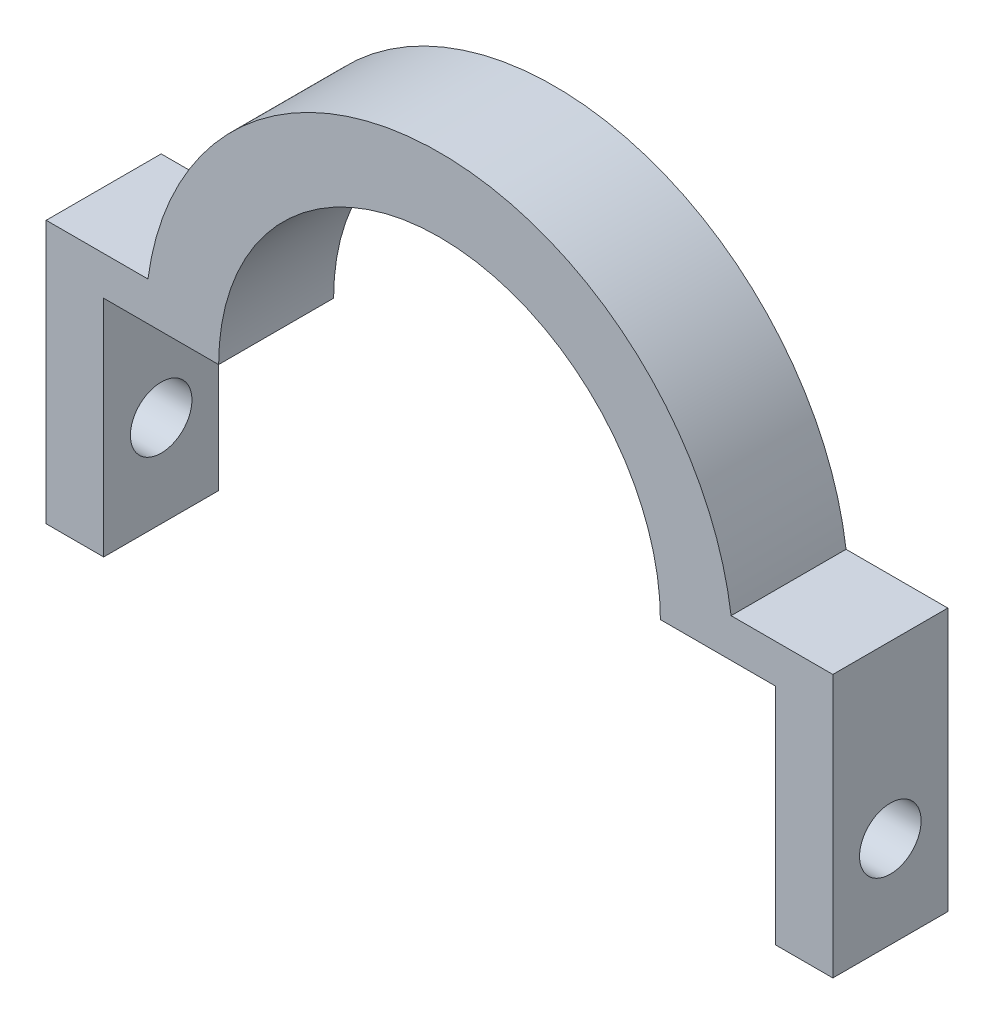
ISO-10303-21;
HEADER;
FILE_DESCRIPTION(('STEP AP214'),'2;1');
FILE_NAME('part.step','',(''),(''),'','','');
FILE_SCHEMA(('AUTOMOTIVE_DESIGN { 1 0 10303 214 1 1 1 1 }'));
ENDSEC;
DATA;
#1=APPLICATION_CONTEXT('core data for automotive mechanical design processes');
#2=APPLICATION_PROTOCOL_DEFINITION('international standard','automotive_design',2000,#1);
#3=PRODUCT_CONTEXT('',#1,'mechanical');
#4=PRODUCT('Part','Part','',(#3));
#5=PRODUCT_RELATED_PRODUCT_CATEGORY('part','',(#4));
#6=PRODUCT_DEFINITION_FORMATION('','',#4);
#7=PRODUCT_DEFINITION_CONTEXT('part definition',#1,'design');
#8=PRODUCT_DEFINITION('design','',#6,#7);
#9=PRODUCT_DEFINITION_SHAPE('','',#8);
#10=(LENGTH_UNIT() NAMED_UNIT(*) SI_UNIT(.MILLI.,.METRE.));
#11=(NAMED_UNIT(*) PLANE_ANGLE_UNIT() SI_UNIT($,.RADIAN.));
#12=(NAMED_UNIT(*) SI_UNIT($,.STERADIAN.) SOLID_ANGLE_UNIT());
#13=UNCERTAINTY_MEASURE_WITH_UNIT(LENGTH_MEASURE(1.E-05),#10,'distance_accuracy_value','');
#14=(GEOMETRIC_REPRESENTATION_CONTEXT(3) GLOBAL_UNCERTAINTY_ASSIGNED_CONTEXT((#13)) GLOBAL_UNIT_ASSIGNED_CONTEXT((#10,
#11,#12)) REPRESENTATION_CONTEXT('',''));
#15=CARTESIAN_POINT('',(0.,0.,0.));
#16=DIRECTION('',(0.,0.,1.));
#17=DIRECTION('',(1.,0.,0.));
#18=AXIS2_PLACEMENT_3D('',#15,#16,#17);
#19=CARTESIAN_POINT('',(23.3069696645957,12.38,6.35));
#20=DIRECTION('',(0.,0.,-1.));
#21=DIRECTION('',(-1.,0.,0.));
#22=AXIS2_PLACEMENT_3D('',#19,#20,#21);
#23=CYLINDRICAL_SURFACE('',#22,16.2467199286248);
#24=CARTESIAN_POINT('',(23.3069696645957,12.38,0.));
#25=DIRECTION('',(0.,0.,1.));
#26=DIRECTION('',(-1.,0.,0.));
#27=AXIS2_PLACEMENT_3D('',#24,#25,#26);
#28=CIRCLE('',#27,16.2467199286248);
#29=CARTESIAN_POINT('',(39.4119951559712,14.5210423539286,0.));
#30=VERTEX_POINT('',#29);
#31=CARTESIAN_POINT('',(7.20194417322011,14.5210423539286,0.));
#32=VERTEX_POINT('',#31);
#33=EDGE_CURVE('E157',#30,#32,#28,.T.);
#34=ORIENTED_EDGE('',*,*,#33,.T.);
#35=DIRECTION('',(0.,0.,-1.));
#36=VECTOR('',#35,1.);
#37=CARTESIAN_POINT('',(7.20194417322011,14.5210423539286,6.35));
#38=LINE('',#37,#36);
#39=CARTESIAN_POINT('',(7.20194417322011,14.5210423539286,6.35));
#40=VERTEX_POINT('',#39);
#41=EDGE_CURVE('E11',#40,#32,#38,.T.);
#42=ORIENTED_EDGE('',*,*,#41,.F.);
#43=CARTESIAN_POINT('',(23.3069696645957,12.38,6.35));
#44=DIRECTION('',(0.,0.,1.));
#45=DIRECTION('',(-1.,0.,0.));
#46=AXIS2_PLACEMENT_3D('',#43,#44,#45);
#47=CIRCLE('',#46,16.2467199286248);
#48=CARTESIAN_POINT('',(39.4119951559712,14.5210423539286,6.35));
#49=VERTEX_POINT('',#48);
#50=EDGE_CURVE('E180',#49,#40,#47,.T.);
#51=ORIENTED_EDGE('',*,*,#50,.F.);
#52=DIRECTION('',(0.,0.,-1.));
#53=VECTOR('',#52,1.);
#54=CARTESIAN_POINT('',(39.4119951559712,14.5210423539286,6.35));
#55=LINE('',#54,#53);
#56=EDGE_CURVE('E153',#49,#30,#55,.T.);
#57=ORIENTED_EDGE('',*,*,#56,.T.);
#58=EDGE_LOOP('',(#34,#42,#51,#57));
#59=FACE_BOUND('',#58,.T.);
#60=ADVANCED_FACE('F36',(#59),#23,.T.);
#61=CARTESIAN_POINT('',(7.20194417322011,14.5210423539286,6.35));
#62=DIRECTION('',(0.,-1.,0.));
#63=DIRECTION('',(1.,0.,0.));
#64=AXIS2_PLACEMENT_3D('',#61,#62,#63);
#65=PLANE('',#64);
#66=DIRECTION('',(-1.,0.,0.));
#67=VECTOR('',#66,1.);
#68=CARTESIAN_POINT('',(7.20194417322011,14.5210423539286,0.));
#69=LINE('',#68,#67);
#70=CARTESIAN_POINT('',(1.58196968059567,14.5210423539286,0.));
#71=VERTEX_POINT('',#70);
#72=EDGE_CURVE('E160',#32,#71,#69,.T.);
#73=ORIENTED_EDGE('',*,*,#72,.T.);
#74=DIRECTION('',(0.,0.,-1.));
#75=VECTOR('',#74,1.);
#76=CARTESIAN_POINT('',(1.58196968059567,14.5210423539286,6.35));
#77=LINE('',#76,#75);
#78=CARTESIAN_POINT('',(1.58196968059567,14.5210423539286,6.35));
#79=VERTEX_POINT('',#78);
#80=EDGE_CURVE('E45',#79,#71,#77,.T.);
#81=ORIENTED_EDGE('',*,*,#80,.F.);
#82=DIRECTION('',(-1.,0.,0.));
#83=VECTOR('',#82,1.);
#84=CARTESIAN_POINT('',(7.20194417322011,14.5210423539286,6.35));
#85=LINE('',#84,#83);
#86=EDGE_CURVE('E108',#40,#79,#85,.T.);
#87=ORIENTED_EDGE('',*,*,#86,.F.);
#88=ORIENTED_EDGE('',*,*,#41,.T.);
#89=EDGE_LOOP('',(#73,#81,#87,#88));
#90=FACE_BOUND('',#89,.T.);
#91=ADVANCED_FACE('F260',(#90),#65,.F.);
#92=CARTESIAN_POINT('',(1.58196968059567,14.5210423539286,6.35));
#93=DIRECTION('',(1.,0.,0.));
#94=DIRECTION('',(0.,1.,0.));
#95=AXIS2_PLACEMENT_3D('',#92,#93,#94);
#96=PLANE('',#95);
#97=CARTESIAN_POINT('',(1.58196968059567,5.08,3.175));
#98=DIRECTION('',(1.,0.,0.));
#99=DIRECTION('',(0.,0.,-1.));
#100=AXIS2_PLACEMENT_3D('',#97,#98,#99);
#101=CIRCLE('',#100,1.7);
#102=CARTESIAN_POINT('',(1.58196968059567,5.08,1.475));
#103=VERTEX_POINT('',#102);
#104=EDGE_CURVE('E422',#103,#103,#101,.T.);
#105=ORIENTED_EDGE('',*,*,#104,.T.);
#106=EDGE_LOOP('',(#105));
#107=FACE_BOUND('',#106,.T.);
#108=DIRECTION('',(0.,-1.,0.));
#109=VECTOR('',#108,1.);
#110=CARTESIAN_POINT('',(1.58196968059567,14.5210423539286,0.));
#111=LINE('',#110,#109);
#112=CARTESIAN_POINT('',(1.58196968059567,0.,0.));
#113=VERTEX_POINT('',#112);
#114=EDGE_CURVE('E163',#71,#113,#111,.T.);
#115=ORIENTED_EDGE('',*,*,#114,.T.);
#116=DIRECTION('',(0.,0.,-1.));
#117=VECTOR('',#116,1.);
#118=CARTESIAN_POINT('',(1.58196968059567,0.,6.35));
#119=LINE('',#118,#117);
#120=CARTESIAN_POINT('',(1.58196968059567,0.,6.35));
#121=VERTEX_POINT('',#120);
#122=EDGE_CURVE('E199',#121,#113,#119,.T.);
#123=ORIENTED_EDGE('',*,*,#122,.F.);
#124=DIRECTION('',(0.,-1.,0.));
#125=VECTOR('',#124,1.);
#126=CARTESIAN_POINT('',(1.58196968059567,14.5210423539286,6.35));
#127=LINE('',#126,#125);
#128=EDGE_CURVE('E208',#79,#121,#127,.T.);
#129=ORIENTED_EDGE('',*,*,#128,.F.);
#130=ORIENTED_EDGE('',*,*,#80,.T.);
#131=EDGE_LOOP('',(#115,#123,#129,#130));
#132=FACE_BOUND('',#131,.T.);
#133=ADVANCED_FACE('F206',(#107,#132),#96,.F.);
#134=CARTESIAN_POINT('',(4.75696968059567,0.,6.35));
#135=DIRECTION('',(0.,1.,0.));
#136=DIRECTION('',(-1.,0.,0.));
#137=AXIS2_PLACEMENT_3D('',#134,#135,#136);
#138=PLANE('',#137);
#139=DIRECTION('',(1.,0.,0.));
#140=VECTOR('',#139,1.);
#141=CARTESIAN_POINT('',(4.75696968059567,0.,0.));
#142=LINE('',#141,#140);
#143=CARTESIAN_POINT('',(4.75696968059567,0.,0.));
#144=VERTEX_POINT('',#143);
#145=EDGE_CURVE('E165',#113,#144,#142,.T.);
#146=ORIENTED_EDGE('',*,*,#145,.T.);
#147=DIRECTION('',(0.,0.,-1.));
#148=VECTOR('',#147,1.);
#149=CARTESIAN_POINT('',(4.75696968059567,0.,6.35));
#150=LINE('',#149,#148);
#151=CARTESIAN_POINT('',(4.75696968059567,0.,6.35));
#152=VERTEX_POINT('',#151);
#153=EDGE_CURVE('E196',#152,#144,#150,.T.);
#154=ORIENTED_EDGE('',*,*,#153,.F.);
#155=DIRECTION('',(1.,0.,0.));
#156=VECTOR('',#155,1.);
#157=CARTESIAN_POINT('',(4.75696968059567,0.,6.35));
#158=LINE('',#157,#156);
#159=EDGE_CURVE('E226',#121,#152,#158,.T.);
#160=ORIENTED_EDGE('',*,*,#159,.F.);
#161=ORIENTED_EDGE('',*,*,#122,.T.);
#162=EDGE_LOOP('',(#146,#154,#160,#161));
#163=FACE_BOUND('',#162,.T.);
#164=ADVANCED_FACE('F217',(#163),#138,.F.);
#165=CARTESIAN_POINT('',(4.75696968059567,12.38,6.35));
#166=DIRECTION('',(-1.,0.,0.));
#167=DIRECTION('',(0.,-1.,0.));
#168=AXIS2_PLACEMENT_3D('',#165,#166,#167);
#169=PLANE('',#168);
#170=CARTESIAN_POINT('',(4.75696968059567,5.08,3.175));
#171=DIRECTION('',(-1.,0.,0.));
#172=DIRECTION('',(0.,-1.,0.));
#173=AXIS2_PLACEMENT_3D('',#170,#171,#172);
#174=CIRCLE('',#173,1.7);
#175=CARTESIAN_POINT('',(4.75696968059567,3.38,3.175));
#176=VERTEX_POINT('',#175);
#177=EDGE_CURVE('E161',#176,#176,#174,.T.);
#178=ORIENTED_EDGE('',*,*,#177,.T.);
#179=EDGE_LOOP('',(#178));
#180=FACE_BOUND('',#179,.T.);
#181=DIRECTION('',(0.,1.,0.));
#182=VECTOR('',#181,1.);
#183=CARTESIAN_POINT('',(4.75696968059567,12.38,0.));
#184=LINE('',#183,#182);
#185=CARTESIAN_POINT('',(4.75696968059567,12.38,0.));
#186=VERTEX_POINT('',#185);
#187=EDGE_CURVE('E167',#144,#186,#184,.T.);
#188=ORIENTED_EDGE('',*,*,#187,.T.);
#189=DIRECTION('',(0.,0.,-1.));
#190=VECTOR('',#189,1.);
#191=CARTESIAN_POINT('',(4.75696968059567,12.38,6.35));
#192=LINE('',#191,#190);
#193=CARTESIAN_POINT('',(4.75696968059567,12.38,6.35));
#194=VERTEX_POINT('',#193);
#195=EDGE_CURVE('E193',#194,#186,#192,.T.);
#196=ORIENTED_EDGE('',*,*,#195,.F.);
#197=DIRECTION('',(0.,1.,0.));
#198=VECTOR('',#197,1.);
#199=CARTESIAN_POINT('',(4.75696968059567,12.38,6.35));
#200=LINE('',#199,#198);
#201=EDGE_CURVE('E223',#152,#194,#200,.T.);
#202=ORIENTED_EDGE('',*,*,#201,.F.);
#203=ORIENTED_EDGE('',*,*,#153,.T.);
#204=EDGE_LOOP('',(#188,#196,#202,#203));
#205=FACE_BOUND('',#204,.T.);
#206=ADVANCED_FACE('F221',(#180,#205),#169,.F.);
#207=CARTESIAN_POINT('',(11.1069696805957,12.38,6.35));
#208=DIRECTION('',(0.,1.,0.));
#209=DIRECTION('',(-1.,0.,0.));
#210=AXIS2_PLACEMENT_3D('',#207,#208,#209);
#211=PLANE('',#210);
#212=DIRECTION('',(1.,0.,0.));
#213=VECTOR('',#212,1.);
#214=CARTESIAN_POINT('',(11.1069696805957,12.38,0.));
#215=LINE('',#214,#213);
#216=CARTESIAN_POINT('',(11.1069696805957,12.38,0.));
#217=VERTEX_POINT('',#216);
#218=EDGE_CURVE('E169',#186,#217,#215,.T.);
#219=ORIENTED_EDGE('',*,*,#218,.T.);
#220=DIRECTION('',(0.,0.,-1.));
#221=VECTOR('',#220,1.);
#222=CARTESIAN_POINT('',(11.1069696805957,12.38,6.35));
#223=LINE('',#222,#221);
#224=CARTESIAN_POINT('',(11.1069696805957,12.38,6.35));
#225=VERTEX_POINT('',#224);
#226=EDGE_CURVE('E190',#225,#217,#223,.T.);
#227=ORIENTED_EDGE('',*,*,#226,.F.);
#228=DIRECTION('',(1.,0.,0.));
#229=VECTOR('',#228,1.);
#230=CARTESIAN_POINT('',(11.1069696805957,12.38,6.35));
#231=LINE('',#230,#229);
#232=EDGE_CURVE('E225',#194,#225,#231,.T.);
#233=ORIENTED_EDGE('',*,*,#232,.F.);
#234=ORIENTED_EDGE('',*,*,#195,.T.);
#235=EDGE_LOOP('',(#219,#227,#233,#234));
#236=FACE_BOUND('',#235,.T.);
#237=ADVANCED_FACE('F274',(#236),#211,.F.);
#238=CARTESIAN_POINT('',(23.3069696645957,12.38,6.35));
#239=DIRECTION('',(0.,0.,-1.));
#240=DIRECTION('',(-1.,0.,0.));
#241=AXIS2_PLACEMENT_3D('',#238,#239,#240);
#242=CYLINDRICAL_SURFACE('',#241,12.199999984);
#243=CARTESIAN_POINT('',(23.3069696645957,12.38,0.));
#244=DIRECTION('',(0.,0.,-1.));
#245=DIRECTION('',(1.,0.,0.));
#246=AXIS2_PLACEMENT_3D('',#243,#244,#245);
#247=CIRCLE('',#246,12.199999984);
#248=CARTESIAN_POINT('',(35.5069696485957,12.38,0.));
#249=VERTEX_POINT('',#248);
#250=EDGE_CURVE('E171',#217,#249,#247,.T.);
#251=ORIENTED_EDGE('',*,*,#250,.T.);
#252=DIRECTION('',(0.,0.,-1.));
#253=VECTOR('',#252,1.);
#254=CARTESIAN_POINT('',(35.5069696485957,12.38,6.35));
#255=LINE('',#254,#253);
#256=CARTESIAN_POINT('',(35.5069696485957,12.38,6.35));
#257=VERTEX_POINT('',#256);
#258=EDGE_CURVE('E187',#257,#249,#255,.T.);
#259=ORIENTED_EDGE('',*,*,#258,.F.);
#260=CARTESIAN_POINT('',(23.3069696645957,12.38,6.35));
#261=DIRECTION('',(0.,0.,-1.));
#262=DIRECTION('',(1.,0.,0.));
#263=AXIS2_PLACEMENT_3D('',#260,#261,#262);
#264=CIRCLE('',#263,12.199999984);
#265=EDGE_CURVE('E228',#225,#257,#264,.T.);
#266=ORIENTED_EDGE('',*,*,#265,.F.);
#267=ORIENTED_EDGE('',*,*,#226,.T.);
#268=EDGE_LOOP('',(#251,#259,#266,#267));
#269=FACE_BOUND('',#268,.T.);
#270=ADVANCED_FACE('F278',(#269),#242,.F.);
#271=CARTESIAN_POINT('',(35.5069696485957,12.38,6.35));
#272=DIRECTION('',(0.,1.,0.));
#273=DIRECTION('',(0.,0.,1.));
#274=AXIS2_PLACEMENT_3D('',#271,#272,#273);
#275=PLANE('',#274);
#276=DIRECTION('',(1.,0.,0.));
#277=VECTOR('',#276,1.);
#278=CARTESIAN_POINT('',(35.5069696485957,12.38,0.));
#279=LINE('',#278,#277);
#280=CARTESIAN_POINT('',(41.8569696485957,12.38,0.));
#281=VERTEX_POINT('',#280);
#282=EDGE_CURVE('E173',#249,#281,#279,.T.);
#283=ORIENTED_EDGE('',*,*,#282,.T.);
#284=DIRECTION('',(0.,0.,-1.));
#285=VECTOR('',#284,1.);
#286=CARTESIAN_POINT('',(41.8569696485957,12.38,6.35));
#287=LINE('',#286,#285);
#288=CARTESIAN_POINT('',(41.8569696485957,12.38,6.35));
#289=VERTEX_POINT('',#288);
#290=EDGE_CURVE('E184',#289,#281,#287,.T.);
#291=ORIENTED_EDGE('',*,*,#290,.F.);
#292=DIRECTION('',(1.,0.,0.));
#293=VECTOR('',#292,1.);
#294=CARTESIAN_POINT('',(35.5069696485957,12.38,6.35));
#295=LINE('',#294,#293);
#296=EDGE_CURVE('E234',#257,#289,#295,.T.);
#297=ORIENTED_EDGE('',*,*,#296,.F.);
#298=ORIENTED_EDGE('',*,*,#258,.T.);
#299=EDGE_LOOP('',(#283,#291,#297,#298));
#300=FACE_BOUND('',#299,.T.);
#301=ADVANCED_FACE('F240',(#300),#275,.F.);
#302=CARTESIAN_POINT('',(41.8569696485957,12.38,6.35));
#303=DIRECTION('',(1.,0.,0.));
#304=DIRECTION('',(0.,0.,-1.));
#305=AXIS2_PLACEMENT_3D('',#302,#303,#304);
#306=PLANE('',#305);
#307=CARTESIAN_POINT('',(41.8569696485957,5.08,3.175));
#308=DIRECTION('',(1.,0.,0.));
#309=DIRECTION('',(0.,0.,-1.));
#310=AXIS2_PLACEMENT_3D('',#307,#308,#309);
#311=CIRCLE('',#310,1.7);
#312=CARTESIAN_POINT('',(41.8569696485957,5.08,1.475));
#313=VERTEX_POINT('',#312);
#314=EDGE_CURVE('E425',#313,#313,#311,.T.);
#315=ORIENTED_EDGE('',*,*,#314,.T.);
#316=EDGE_LOOP('',(#315));
#317=FACE_BOUND('',#316,.T.);
#318=DIRECTION('',(0.,-1.,0.));
#319=VECTOR('',#318,1.);
#320=CARTESIAN_POINT('',(41.8569696485957,12.38,0.));
#321=LINE('',#320,#319);
#322=CARTESIAN_POINT('',(41.8569696485957,0.,0.));
#323=VERTEX_POINT('',#322);
#324=EDGE_CURVE('E175',#281,#323,#321,.T.);
#325=ORIENTED_EDGE('',*,*,#324,.T.);
#326=DIRECTION('',(0.,0.,-1.));
#327=VECTOR('',#326,1.);
#328=CARTESIAN_POINT('',(41.8569696485957,0.,6.35));
#329=LINE('',#328,#327);
#330=CARTESIAN_POINT('',(41.8569696485957,0.,6.35));
#331=VERTEX_POINT('',#330);
#332=EDGE_CURVE('E148',#331,#323,#329,.T.);
#333=ORIENTED_EDGE('',*,*,#332,.F.);
#334=DIRECTION('',(0.,-1.,0.));
#335=VECTOR('',#334,1.);
#336=CARTESIAN_POINT('',(41.8569696485957,12.38,6.35));
#337=LINE('',#336,#335);
#338=EDGE_CURVE('E139',#289,#331,#337,.T.);
#339=ORIENTED_EDGE('',*,*,#338,.F.);
#340=ORIENTED_EDGE('',*,*,#290,.T.);
#341=EDGE_LOOP('',(#325,#333,#339,#340));
#342=FACE_BOUND('',#341,.T.);
#343=ADVANCED_FACE('F244',(#317,#342),#306,.F.);
#344=CARTESIAN_POINT('',(41.8569696485957,0.,6.35));
#345=DIRECTION('',(0.,1.,0.));
#346=DIRECTION('',(-1.,0.,0.));
#347=AXIS2_PLACEMENT_3D('',#344,#345,#346);
#348=PLANE('',#347);
#349=DIRECTION('',(1.,0.,0.));
#350=VECTOR('',#349,1.);
#351=CARTESIAN_POINT('',(41.8569696485957,0.,0.));
#352=LINE('',#351,#350);
#353=CARTESIAN_POINT('',(45.0319696485957,0.,0.));
#354=VERTEX_POINT('',#353);
#355=EDGE_CURVE('E147',#323,#354,#352,.T.);
#356=ORIENTED_EDGE('',*,*,#355,.T.);
#357=DIRECTION('',(0.,0.,-1.));
#358=VECTOR('',#357,1.);
#359=CARTESIAN_POINT('',(45.0319696485957,0.,6.35));
#360=LINE('',#359,#358);
#361=CARTESIAN_POINT('',(45.0319696485957,0.,6.35));
#362=VERTEX_POINT('',#361);
#363=EDGE_CURVE('E144',#362,#354,#360,.T.);
#364=ORIENTED_EDGE('',*,*,#363,.F.);
#365=DIRECTION('',(1.,0.,0.));
#366=VECTOR('',#365,1.);
#367=CARTESIAN_POINT('',(41.8569696485957,0.,6.35));
#368=LINE('',#367,#366);
#369=EDGE_CURVE('E133',#331,#362,#368,.T.);
#370=ORIENTED_EDGE('',*,*,#369,.F.);
#371=ORIENTED_EDGE('',*,*,#332,.T.);
#372=EDGE_LOOP('',(#356,#364,#370,#371));
#373=FACE_BOUND('',#372,.T.);
#374=ADVANCED_FACE('F145',(#373),#348,.F.);
#375=CARTESIAN_POINT('',(45.0319696485957,14.5210423539286,6.35));
#376=DIRECTION('',(-1.,0.,0.));
#377=DIRECTION('',(0.,0.,1.));
#378=AXIS2_PLACEMENT_3D('',#375,#376,#377);
#379=PLANE('',#378);
#380=CARTESIAN_POINT('',(45.0319696485957,5.08,3.175));
#381=DIRECTION('',(-1.,0.,0.));
#382=DIRECTION('',(0.,0.,1.));
#383=AXIS2_PLACEMENT_3D('',#380,#381,#382);
#384=CIRCLE('',#383,1.7);
#385=CARTESIAN_POINT('',(45.0319696485957,5.08,4.875));
#386=VERTEX_POINT('',#385);
#387=EDGE_CURVE('E39',#386,#386,#384,.T.);
#388=ORIENTED_EDGE('',*,*,#387,.T.);
#389=EDGE_LOOP('',(#388));
#390=FACE_BOUND('',#389,.T.);
#391=DIRECTION('',(0.,1.,0.));
#392=VECTOR('',#391,1.);
#393=CARTESIAN_POINT('',(45.0319696485957,14.5210423539286,0.));
#394=LINE('',#393,#392);
#395=CARTESIAN_POINT('',(45.0319696485957,14.5210423539286,0.));
#396=VERTEX_POINT('',#395);
#397=EDGE_CURVE('E94',#354,#396,#394,.T.);
#398=ORIENTED_EDGE('',*,*,#397,.T.);
#399=DIRECTION('',(0.,0.,-1.));
#400=VECTOR('',#399,1.);
#401=CARTESIAN_POINT('',(45.0319696485957,14.5210423539286,6.35));
#402=LINE('',#401,#400);
#403=CARTESIAN_POINT('',(45.0319696485957,14.5210423539286,6.35));
#404=VERTEX_POINT('',#403);
#405=EDGE_CURVE('E149',#404,#396,#402,.T.);
#406=ORIENTED_EDGE('',*,*,#405,.F.);
#407=DIRECTION('',(0.,1.,0.));
#408=VECTOR('',#407,1.);
#409=CARTESIAN_POINT('',(45.0319696485957,14.5210423539286,6.35));
#410=LINE('',#409,#408);
#411=EDGE_CURVE('E137',#362,#404,#410,.T.);
#412=ORIENTED_EDGE('',*,*,#411,.F.);
#413=ORIENTED_EDGE('',*,*,#363,.T.);
#414=EDGE_LOOP('',(#398,#406,#412,#413));
#415=FACE_BOUND('',#414,.T.);
#416=ADVANCED_FACE('F151',(#390,#415),#379,.F.);
#417=CARTESIAN_POINT('',(39.4119951559712,14.5210423539286,6.35));
#418=DIRECTION('',(0.,-1.,0.));
#419=DIRECTION('',(0.,0.,-1.));
#420=AXIS2_PLACEMENT_3D('',#417,#418,#419);
#421=PLANE('',#420);
#422=DIRECTION('',(-1.,0.,0.));
#423=VECTOR('',#422,1.);
#424=CARTESIAN_POINT('',(39.4119951559712,14.5210423539286,0.));
#425=LINE('',#424,#423);
#426=EDGE_CURVE('E100',#396,#30,#425,.T.);
#427=ORIENTED_EDGE('',*,*,#426,.T.);
#428=ORIENTED_EDGE('',*,*,#56,.F.);
#429=DIRECTION('',(-1.,0.,0.));
#430=VECTOR('',#429,1.);
#431=CARTESIAN_POINT('',(39.4119951559712,14.5210423539286,6.35));
#432=LINE('',#431,#430);
#433=EDGE_CURVE('E53',#404,#49,#432,.T.);
#434=ORIENTED_EDGE('',*,*,#433,.F.);
#435=ORIENTED_EDGE('',*,*,#405,.T.);
#436=EDGE_LOOP('',(#427,#428,#434,#435));
#437=FACE_BOUND('',#436,.T.);
#438=ADVANCED_FACE('F248',(#437),#421,.F.);
#439=CARTESIAN_POINT('',(23.3069696645957,12.38,6.35));
#440=DIRECTION('',(0.,0.,-1.));
#441=DIRECTION('',(-1.,0.,0.));
#442=AXIS2_PLACEMENT_3D('',#439,#440,#441);
#443=PLANE('',#442);
#444=ORIENTED_EDGE('',*,*,#50,.T.);
#445=ORIENTED_EDGE('',*,*,#86,.T.);
#446=ORIENTED_EDGE('',*,*,#128,.T.);
#447=ORIENTED_EDGE('',*,*,#159,.T.);
#448=ORIENTED_EDGE('',*,*,#201,.T.);
#449=ORIENTED_EDGE('',*,*,#232,.T.);
#450=ORIENTED_EDGE('',*,*,#265,.T.);
#451=ORIENTED_EDGE('',*,*,#296,.T.);
#452=ORIENTED_EDGE('',*,*,#338,.T.);
#453=ORIENTED_EDGE('',*,*,#369,.T.);
#454=ORIENTED_EDGE('',*,*,#411,.T.);
#455=ORIENTED_EDGE('',*,*,#433,.T.);
#456=EDGE_LOOP('',(#444,#445,#446,#447,#448,#449,#450,#451,#452,#453,#454,#455));
#457=FACE_BOUND('',#456,.T.);
#458=ADVANCED_FACE('F135',(#457),#443,.F.);
#459=CARTESIAN_POINT('',(23.3069696645957,12.38,0.));
#460=DIRECTION('',(0.,0.,-1.));
#461=DIRECTION('',(-1.,0.,0.));
#462=AXIS2_PLACEMENT_3D('',#459,#460,#461);
#463=PLANE('',#462);
#464=ORIENTED_EDGE('',*,*,#33,.F.);
#465=ORIENTED_EDGE('',*,*,#426,.F.);
#466=ORIENTED_EDGE('',*,*,#397,.F.);
#467=ORIENTED_EDGE('',*,*,#355,.F.);
#468=ORIENTED_EDGE('',*,*,#324,.F.);
#469=ORIENTED_EDGE('',*,*,#282,.F.);
#470=ORIENTED_EDGE('',*,*,#250,.F.);
#471=ORIENTED_EDGE('',*,*,#218,.F.);
#472=ORIENTED_EDGE('',*,*,#187,.F.);
#473=ORIENTED_EDGE('',*,*,#145,.F.);
#474=ORIENTED_EDGE('',*,*,#114,.F.);
#475=ORIENTED_EDGE('',*,*,#72,.F.);
#476=EDGE_LOOP('',(#464,#465,#466,#467,#468,#469,#470,#471,#472,#473,#474,#475));
#477=FACE_BOUND('',#476,.T.);
#478=ADVANCED_FACE('F212',(#477),#463,.T.);
#479=CARTESIAN_POINT('',(1.58196968059567,5.08,3.175));
#480=DIRECTION('',(1.,0.,0.));
#481=DIRECTION('',(0.,0.,-1.));
#482=AXIS2_PLACEMENT_3D('',#479,#480,#481);
#483=CYLINDRICAL_SURFACE('',#482,1.7);
#484=ORIENTED_EDGE('',*,*,#387,.F.);
#485=EDGE_LOOP('',(#484));
#486=FACE_BOUND('',#485,.T.);
#487=ORIENTED_EDGE('',*,*,#314,.F.);
#488=EDGE_LOOP('',(#487));
#489=FACE_BOUND('',#488,.T.);
#490=ADVANCED_FACE('F308',(#486,#489),#483,.F.);
#491=ORIENTED_EDGE('',*,*,#104,.F.);
#492=EDGE_LOOP('',(#491));
#493=FACE_BOUND('',#492,.T.);
#494=ORIENTED_EDGE('',*,*,#177,.F.);
#495=EDGE_LOOP('',(#494));
#496=FACE_BOUND('',#495,.T.);
#497=ADVANCED_FACE('F313',(#493,#496),#483,.F.);
#498=CLOSED_SHELL('',(#60,#91,#133,#164,#206,#237,#270,#301,#343,#374,#416,#438,#458,#478,#490,#497));
#499=MANIFOLD_SOLID_BREP('B2',#498);
#500=ADVANCED_BREP_SHAPE_REPRESENTATION('',(#18,#499),#14);
#501=SHAPE_DEFINITION_REPRESENTATION(#9,#500);
ENDSEC;
END-ISO-10303-21;
